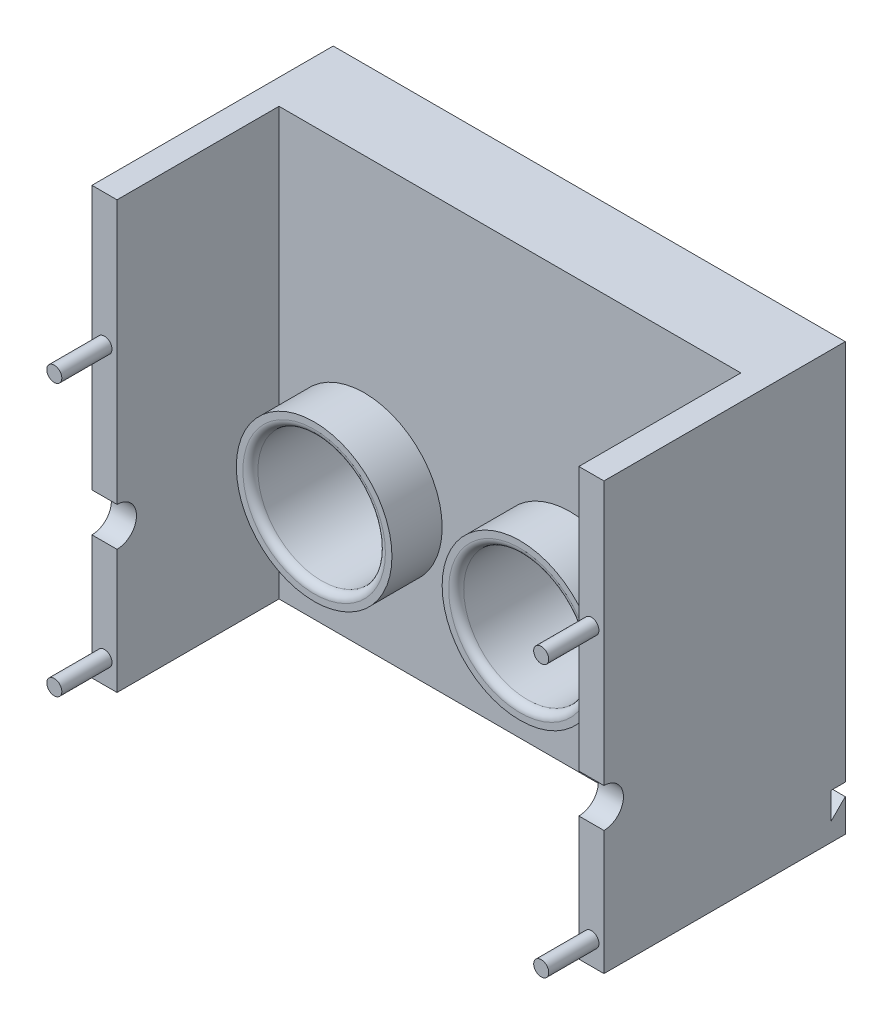
ISO-10303-21;
HEADER;
FILE_DESCRIPTION(('STEP AP214'),'2;1');
FILE_NAME('part.step','',(''),(''),'','','');
FILE_SCHEMA(('AUTOMOTIVE_DESIGN { 1 0 10303 214 1 1 1 1 }'));
ENDSEC;
DATA;
#1=APPLICATION_CONTEXT('core data for automotive mechanical design processes');
#2=APPLICATION_PROTOCOL_DEFINITION('international standard','automotive_design',2000,#1);
#3=PRODUCT_CONTEXT('',#1,'mechanical');
#4=PRODUCT('Part','Part','',(#3));
#5=PRODUCT_RELATED_PRODUCT_CATEGORY('part','',(#4));
#6=PRODUCT_DEFINITION_FORMATION('','',#4);
#7=PRODUCT_DEFINITION_CONTEXT('part definition',#1,'design');
#8=PRODUCT_DEFINITION('design','',#6,#7);
#9=PRODUCT_DEFINITION_SHAPE('','',#8);
#10=(LENGTH_UNIT() NAMED_UNIT(*) SI_UNIT(.MILLI.,.METRE.));
#11=(NAMED_UNIT(*) PLANE_ANGLE_UNIT() SI_UNIT($,.RADIAN.));
#12=(NAMED_UNIT(*) SI_UNIT($,.STERADIAN.) SOLID_ANGLE_UNIT());
#13=UNCERTAINTY_MEASURE_WITH_UNIT(LENGTH_MEASURE(1.E-05),#10,'distance_accuracy_value','');
#14=(GEOMETRIC_REPRESENTATION_CONTEXT(3) GLOBAL_UNCERTAINTY_ASSIGNED_CONTEXT((#13)) GLOBAL_UNIT_ASSIGNED_CONTEXT((#10,
#11,#12)) REPRESENTATION_CONTEXT('',''));
#15=CARTESIAN_POINT('',(0.,0.,0.));
#16=DIRECTION('',(0.,0.,1.));
#17=DIRECTION('',(1.,0.,0.));
#18=AXIS2_PLACEMENT_3D('',#15,#16,#17);
#19=CARTESIAN_POINT('',(51.,85.,-48.065));
#20=DIRECTION('',(0.,0.,1.));
#21=DIRECTION('',(1.,0.,0.));
#22=AXIS2_PLACEMENT_3D('',#19,#20,#21);
#23=PLANE('',#22);
#24=CARTESIAN_POINT('',(-29.,28.575,-48.065));
#25=DIRECTION('',(0.,0.,-1.));
#26=DIRECTION('',(-1.,0.,0.));
#27=AXIS2_PLACEMENT_3D('',#24,#25,#26);
#28=CIRCLE('',#27,12.7);
#29=CARTESIAN_POINT('',(-41.7,28.575,-48.065));
#30=VERTEX_POINT('',#29);
#31=EDGE_CURVE('E246',#30,#30,#28,.T.);
#32=ORIENTED_EDGE('',*,*,#31,.F.);
#33=EDGE_LOOP('',(#32));
#34=FACE_BOUND('',#33,.T.);
#35=CARTESIAN_POINT('',(12.,28.575,-48.065));
#36=DIRECTION('',(0.,0.,-1.));
#37=DIRECTION('',(-1.,0.,0.));
#38=AXIS2_PLACEMENT_3D('',#35,#36,#37);
#39=CIRCLE('',#38,12.7);
#40=CARTESIAN_POINT('',(-0.700000000000003,28.575,-48.065));
#41=VERTEX_POINT('',#40);
#42=EDGE_CURVE('E247',#41,#41,#39,.T.);
#43=ORIENTED_EDGE('',*,*,#42,.F.);
#44=EDGE_LOOP('',(#43));
#45=FACE_BOUND('',#44,.T.);
#46=DIRECTION('',(0.,-1.,0.));
#47=VECTOR('',#46,1.);
#48=CARTESIAN_POINT('',(51.,85.,-48.065));
#49=LINE('',#48,#47);
#50=CARTESIAN_POINT('',(51.,85.,-48.065));
#51=VERTEX_POINT('',#50);
#52=CARTESIAN_POINT('',(51.,9.,-48.065));
#53=VERTEX_POINT('',#52);
#54=EDGE_CURVE('E291',#51,#53,#49,.T.);
#55=ORIENTED_EDGE('',*,*,#54,.T.);
#56=DIRECTION('',(-1.,0.,0.));
#57=VECTOR('',#56,1.);
#58=CARTESIAN_POINT('',(51.,9.,-48.065));
#59=LINE('',#58,#57);
#60=CARTESIAN_POINT('',(-51.,9.,-48.065));
#61=VERTEX_POINT('',#60);
#62=EDGE_CURVE('E183',#53,#61,#59,.T.);
#63=ORIENTED_EDGE('',*,*,#62,.T.);
#64=DIRECTION('',(0.,-1.,0.));
#65=VECTOR('',#64,1.);
#66=CARTESIAN_POINT('',(-51.,85.,-48.065));
#67=LINE('',#66,#65);
#68=CARTESIAN_POINT('',(-51.,85.,-48.065));
#69=VERTEX_POINT('',#68);
#70=EDGE_CURVE('E288',#69,#61,#67,.T.);
#71=ORIENTED_EDGE('',*,*,#70,.F.);
#72=DIRECTION('',(-1.,0.,0.));
#73=VECTOR('',#72,1.);
#74=CARTESIAN_POINT('',(51.,85.,-48.065));
#75=LINE('',#74,#73);
#76=EDGE_CURVE('E279',#51,#69,#75,.T.);
#77=ORIENTED_EDGE('',*,*,#76,.F.);
#78=EDGE_LOOP('',(#55,#63,#71,#77));
#79=FACE_BOUND('',#78,.T.);
#80=ADVANCED_FACE('F41',(#34,#45,#79),#23,.F.);
#81=CARTESIAN_POINT('',(-46.,85.,-32.265));
#82=DIRECTION('',(0.,0.,1.));
#83=DIRECTION('',(1.,0.,0.));
#84=AXIS2_PLACEMENT_3D('',#81,#82,#83);
#85=PLANE('',#84);
#86=CARTESIAN_POINT('',(12.,28.575,-32.265));
#87=DIRECTION('',(0.,0.,1.));
#88=DIRECTION('',(1.,0.,0.));
#89=AXIS2_PLACEMENT_3D('',#86,#87,#88);
#90=CIRCLE('',#89,15.5);
#91=CARTESIAN_POINT('',(27.5,28.575,-32.265));
#92=VERTEX_POINT('',#91);
#93=EDGE_CURVE('E192',#92,#92,#90,.T.);
#94=ORIENTED_EDGE('',*,*,#93,.F.);
#95=EDGE_LOOP('',(#94));
#96=FACE_BOUND('',#95,.T.);
#97=DIRECTION('',(-1.,0.,0.));
#98=VECTOR('',#97,1.);
#99=CARTESIAN_POINT('',(-46.,0.,-32.265));
#100=LINE('',#99,#98);
#101=CARTESIAN_POINT('',(46.,0.,-32.265));
#102=VERTEX_POINT('',#101);
#103=CARTESIAN_POINT('',(-46.,0.,-32.265));
#104=VERTEX_POINT('',#103);
#105=EDGE_CURVE('E263',#102,#104,#100,.T.);
#106=ORIENTED_EDGE('',*,*,#105,.F.);
#107=DIRECTION('',(0.,-1.,0.));
#108=VECTOR('',#107,1.);
#109=CARTESIAN_POINT('',(46.,85.,-32.265));
#110=LINE('',#109,#108);
#111=CARTESIAN_POINT('',(46.,85.,-32.265));
#112=VERTEX_POINT('',#111);
#113=EDGE_CURVE('E269',#112,#102,#110,.T.);
#114=ORIENTED_EDGE('',*,*,#113,.F.);
#115=DIRECTION('',(-1.,0.,0.));
#116=VECTOR('',#115,1.);
#117=CARTESIAN_POINT('',(-46.,85.,-32.265));
#118=LINE('',#117,#116);
#119=CARTESIAN_POINT('',(-46.,85.,-32.265));
#120=VERTEX_POINT('',#119);
#121=EDGE_CURVE('E255',#112,#120,#118,.T.);
#122=ORIENTED_EDGE('',*,*,#121,.T.);
#123=DIRECTION('',(0.,-1.,0.));
#124=VECTOR('',#123,1.);
#125=CARTESIAN_POINT('',(-46.,85.,-32.265));
#126=LINE('',#125,#124);
#127=EDGE_CURVE('E261',#120,#104,#126,.T.);
#128=ORIENTED_EDGE('',*,*,#127,.T.);
#129=EDGE_LOOP('',(#106,#114,#122,#128));
#130=FACE_BOUND('',#129,.T.);
#131=CARTESIAN_POINT('',(-29.,28.575,-32.265));
#132=DIRECTION('',(0.,0.,1.));
#133=DIRECTION('',(1.,0.,0.));
#134=AXIS2_PLACEMENT_3D('',#131,#132,#133);
#135=CIRCLE('',#134,15.5);
#136=CARTESIAN_POINT('',(-13.5,28.575,-32.265));
#137=VERTEX_POINT('',#136);
#138=EDGE_CURVE('E189',#137,#137,#135,.T.);
#139=ORIENTED_EDGE('',*,*,#138,.F.);
#140=EDGE_LOOP('',(#139));
#141=FACE_BOUND('',#140,.T.);
#142=ADVANCED_FACE('F339',(#96,#130,#141),#85,.T.);
#143=CARTESIAN_POINT('',(0.,85.,0.));
#144=DIRECTION('',(0.,1.,0.));
#145=DIRECTION('',(0.,0.,1.));
#146=AXIS2_PLACEMENT_3D('',#143,#144,#145);
#147=PLANE('',#146);
#148=DIRECTION('',(-1.,0.,0.));
#149=VECTOR('',#148,1.);
#150=CARTESIAN_POINT('',(51.,85.,0.));
#151=LINE('',#150,#149);
#152=CARTESIAN_POINT('',(51.,85.,0.));
#153=VERTEX_POINT('',#152);
#154=CARTESIAN_POINT('',(46.,85.,0.));
#155=VERTEX_POINT('',#154);
#156=EDGE_CURVE('E224',#153,#155,#151,.T.);
#157=ORIENTED_EDGE('',*,*,#156,.F.);
#158=DIRECTION('',(0.,0.,-1.));
#159=VECTOR('',#158,1.);
#160=CARTESIAN_POINT('',(51.,85.,48.065));
#161=LINE('',#160,#159);
#162=EDGE_CURVE('E276',#153,#51,#161,.T.);
#163=ORIENTED_EDGE('',*,*,#162,.T.);
#164=ORIENTED_EDGE('',*,*,#76,.T.);
#165=DIRECTION('',(0.,0.,1.));
#166=VECTOR('',#165,1.);
#167=CARTESIAN_POINT('',(-51.,85.,48.065));
#168=LINE('',#167,#166);
#169=CARTESIAN_POINT('',(-51.,85.,0.));
#170=VERTEX_POINT('',#169);
#171=EDGE_CURVE('E273',#69,#170,#168,.T.);
#172=ORIENTED_EDGE('',*,*,#171,.T.);
#173=CARTESIAN_POINT('',(-46.,85.,0.));
#174=VERTEX_POINT('',#173);
#175=EDGE_CURVE('E216',#174,#170,#151,.T.);
#176=ORIENTED_EDGE('',*,*,#175,.F.);
#177=DIRECTION('',(0.,0.,1.));
#178=VECTOR('',#177,1.);
#179=CARTESIAN_POINT('',(-46.,85.,32.265));
#180=LINE('',#179,#178);
#181=EDGE_CURVE('E258',#120,#174,#180,.T.);
#182=ORIENTED_EDGE('',*,*,#181,.F.);
#183=ORIENTED_EDGE('',*,*,#121,.F.);
#184=DIRECTION('',(0.,0.,-1.));
#185=VECTOR('',#184,1.);
#186=CARTESIAN_POINT('',(46.,85.,32.265));
#187=LINE('',#186,#185);
#188=EDGE_CURVE('E253',#155,#112,#187,.T.);
#189=ORIENTED_EDGE('',*,*,#188,.F.);
#190=EDGE_LOOP('',(#157,#163,#164,#172,#176,#182,#183,#189));
#191=FACE_BOUND('',#190,.T.);
#192=ADVANCED_FACE('F347',(#191),#147,.T.);
#193=CARTESIAN_POINT('',(0.,0.,0.));
#194=DIRECTION('',(0.,1.,0.));
#195=DIRECTION('',(0.,0.,1.));
#196=AXIS2_PLACEMENT_3D('',#193,#194,#195);
#197=PLANE('',#196);
#198=DIRECTION('',(0.,0.,-1.));
#199=VECTOR('',#198,1.);
#200=CARTESIAN_POINT('',(51.,0.,48.065));
#201=LINE('',#200,#199);
#202=CARTESIAN_POINT('',(51.,0.,0.));
#203=VERTEX_POINT('',#202);
#204=CARTESIAN_POINT('',(51.,0.,-48.065));
#205=VERTEX_POINT('',#204);
#206=EDGE_CURVE('E284',#203,#205,#201,.T.);
#207=ORIENTED_EDGE('',*,*,#206,.F.);
#208=DIRECTION('',(-1.,0.,0.));
#209=VECTOR('',#208,1.);
#210=CARTESIAN_POINT('',(51.,0.,0.));
#211=LINE('',#210,#209);
#212=CARTESIAN_POINT('',(46.,0.,0.));
#213=VERTEX_POINT('',#212);
#214=EDGE_CURVE('E219',#203,#213,#211,.T.);
#215=ORIENTED_EDGE('',*,*,#214,.T.);
#216=DIRECTION('',(0.,0.,-1.));
#217=VECTOR('',#216,1.);
#218=CARTESIAN_POINT('',(46.,0.,32.265));
#219=LINE('',#218,#217);
#220=EDGE_CURVE('E250',#213,#102,#219,.T.);
#221=ORIENTED_EDGE('',*,*,#220,.T.);
#222=ORIENTED_EDGE('',*,*,#105,.T.);
#223=DIRECTION('',(0.,0.,1.));
#224=VECTOR('',#223,1.);
#225=CARTESIAN_POINT('',(-46.,0.,32.265));
#226=LINE('',#225,#224);
#227=CARTESIAN_POINT('',(-46.,0.,0.));
#228=VERTEX_POINT('',#227);
#229=EDGE_CURVE('E256',#104,#228,#226,.T.);
#230=ORIENTED_EDGE('',*,*,#229,.T.);
#231=CARTESIAN_POINT('',(-51.,0.,0.));
#232=VERTEX_POINT('',#231);
#233=EDGE_CURVE('E223',#228,#232,#211,.T.);
#234=ORIENTED_EDGE('',*,*,#233,.T.);
#235=DIRECTION('',(0.,0.,1.));
#236=VECTOR('',#235,1.);
#237=CARTESIAN_POINT('',(-51.,0.,48.065));
#238=LINE('',#237,#236);
#239=CARTESIAN_POINT('',(-51.,0.,-48.065));
#240=VERTEX_POINT('',#239);
#241=EDGE_CURVE('E272',#240,#232,#238,.T.);
#242=ORIENTED_EDGE('',*,*,#241,.F.);
#243=DIRECTION('',(-1.,0.,0.));
#244=VECTOR('',#243,1.);
#245=CARTESIAN_POINT('',(51.,0.,-48.065));
#246=LINE('',#245,#244);
#247=EDGE_CURVE('E277',#205,#240,#246,.T.);
#248=ORIENTED_EDGE('',*,*,#247,.F.);
#249=EDGE_LOOP('',(#207,#215,#221,#222,#230,#234,#242,#248));
#250=FACE_BOUND('',#249,.T.);
#251=ADVANCED_FACE('F395',(#250),#197,.F.);
#252=CARTESIAN_POINT('',(-51.,85.,48.065));
#253=DIRECTION('',(1.,0.,0.));
#254=DIRECTION('',(0.,0.,-1.));
#255=AXIS2_PLACEMENT_3D('',#252,#253,#254);
#256=PLANE('',#255);
#257=ORIENTED_EDGE('',*,*,#70,.T.);
#258=DIRECTION('',(0.,0.,-1.));
#259=VECTOR('',#258,1.);
#260=CARTESIAN_POINT('',(-51.,9.,-45.2365728752538));
#261=LINE('',#260,#259);
#262=CARTESIAN_POINT('',(-51.,9.,-45.2365728752538));
#263=VERTEX_POINT('',#262);
#264=EDGE_CURVE('E175',#263,#61,#261,.T.);
#265=ORIENTED_EDGE('',*,*,#264,.F.);
#266=DIRECTION('',(0.,1.,0.));
#267=VECTOR('',#266,1.);
#268=CARTESIAN_POINT('',(-51.,3.67157287525381,-45.2365728752538));
#269=LINE('',#268,#267);
#270=CARTESIAN_POINT('',(-51.,3.67157287525381,-45.2365728752538));
#271=VERTEX_POINT('',#270);
#272=EDGE_CURVE('E177',#271,#263,#269,.T.);
#273=ORIENTED_EDGE('',*,*,#272,.F.);
#274=DIRECTION('',(0.,-0.707106781186547,0.707106781186548));
#275=VECTOR('',#274,1.);
#276=CARTESIAN_POINT('',(-51.,6.5,-48.065));
#277=LINE('',#276,#275);
#278=CARTESIAN_POINT('',(-51.,6.5,-48.065));
#279=VERTEX_POINT('',#278);
#280=EDGE_CURVE('E156',#279,#271,#277,.T.);
#281=ORIENTED_EDGE('',*,*,#280,.F.);
#282=EDGE_CURVE('E281',#279,#240,#67,.T.);
#283=ORIENTED_EDGE('',*,*,#282,.T.);
#284=ORIENTED_EDGE('',*,*,#241,.T.);
#285=DIRECTION('',(0.,-1.,0.));
#286=VECTOR('',#285,1.);
#287=CARTESIAN_POINT('',(-51.,85.,0.));
#288=LINE('',#287,#286);
#289=CARTESIAN_POINT('',(-51.,24.7,0.));
#290=VERTEX_POINT('',#289);
#291=EDGE_CURVE('E212',#290,#232,#288,.T.);
#292=ORIENTED_EDGE('',*,*,#291,.F.);
#293=CARTESIAN_POINT('',(-51.,28.575,0.));
#294=DIRECTION('',(-1.,0.,0.));
#295=DIRECTION('',(0.,0.,1.));
#296=AXIS2_PLACEMENT_3D('',#293,#294,#295);
#297=CIRCLE('',#296,3.875);
#298=CARTESIAN_POINT('',(-51.,32.45,0.));
#299=VERTEX_POINT('',#298);
#300=EDGE_CURVE('E240',#299,#290,#297,.T.);
#301=ORIENTED_EDGE('',*,*,#300,.F.);
#302=EDGE_CURVE('E64',#170,#299,#288,.T.);
#303=ORIENTED_EDGE('',*,*,#302,.F.);
#304=ORIENTED_EDGE('',*,*,#171,.F.);
#305=EDGE_LOOP('',(#257,#265,#273,#281,#283,#284,#292,#301,#303,#304));
#306=FACE_BOUND('',#305,.T.);
#307=ADVANCED_FACE('F364',(#306),#256,.F.);
#308=CARTESIAN_POINT('',(51.,85.,48.065));
#309=DIRECTION('',(-1.,0.,0.));
#310=DIRECTION('',(0.,0.,1.));
#311=AXIS2_PLACEMENT_3D('',#308,#309,#310);
#312=PLANE('',#311);
#313=DIRECTION('',(0.,1.,0.));
#314=VECTOR('',#313,1.);
#315=CARTESIAN_POINT('',(51.,3.67157287525381,-45.2365728752538));
#316=LINE('',#315,#314);
#317=CARTESIAN_POINT('',(51.,3.67157287525381,-45.2365728752538));
#318=VERTEX_POINT('',#317);
#319=CARTESIAN_POINT('',(51.,9.,-45.2365728752538));
#320=VERTEX_POINT('',#319);
#321=EDGE_CURVE('E164',#318,#320,#316,.T.);
#322=ORIENTED_EDGE('',*,*,#321,.T.);
#323=DIRECTION('',(0.,0.,-1.));
#324=VECTOR('',#323,1.);
#325=CARTESIAN_POINT('',(51.,9.,-45.2365728752538));
#326=LINE('',#325,#324);
#327=EDGE_CURVE('E169',#320,#53,#326,.T.);
#328=ORIENTED_EDGE('',*,*,#327,.T.);
#329=ORIENTED_EDGE('',*,*,#54,.F.);
#330=ORIENTED_EDGE('',*,*,#162,.F.);
#331=DIRECTION('',(0.,-1.,0.));
#332=VECTOR('',#331,1.);
#333=CARTESIAN_POINT('',(51.,85.,0.));
#334=LINE('',#333,#332);
#335=CARTESIAN_POINT('',(51.,32.45,0.));
#336=VERTEX_POINT('',#335);
#337=EDGE_CURVE('E213',#153,#336,#334,.T.);
#338=ORIENTED_EDGE('',*,*,#337,.T.);
#339=CARTESIAN_POINT('',(51.,28.575,0.));
#340=DIRECTION('',(-1.,0.,0.));
#341=DIRECTION('',(0.,0.,1.));
#342=AXIS2_PLACEMENT_3D('',#339,#340,#341);
#343=CIRCLE('',#342,3.875);
#344=CARTESIAN_POINT('',(51.,24.7,0.));
#345=VERTEX_POINT('',#344);
#346=EDGE_CURVE('E236',#336,#345,#343,.T.);
#347=ORIENTED_EDGE('',*,*,#346,.T.);
#348=EDGE_CURVE('E217',#345,#203,#334,.T.);
#349=ORIENTED_EDGE('',*,*,#348,.T.);
#350=ORIENTED_EDGE('',*,*,#206,.T.);
#351=CARTESIAN_POINT('',(51.,6.50000000000001,-48.065));
#352=VERTEX_POINT('',#351);
#353=EDGE_CURVE('E174',#352,#205,#49,.T.);
#354=ORIENTED_EDGE('',*,*,#353,.F.);
#355=DIRECTION('',(0.,-0.707106781186547,0.707106781186548));
#356=VECTOR('',#355,1.);
#357=CARTESIAN_POINT('',(51.,6.5,-48.065));
#358=LINE('',#357,#356);
#359=EDGE_CURVE('E56',#352,#318,#358,.T.);
#360=ORIENTED_EDGE('',*,*,#359,.T.);
#361=EDGE_LOOP('',(#322,#328,#329,#330,#338,#347,#349,#350,#354,#360));
#362=FACE_BOUND('',#361,.T.);
#363=ADVANCED_FACE('F172',(#362),#312,.F.);
#364=ORIENTED_EDGE('',*,*,#282,.F.);
#365=DIRECTION('',(-1.,0.,0.));
#366=VECTOR('',#365,1.);
#367=CARTESIAN_POINT('',(51.,6.5,-48.065));
#368=LINE('',#367,#366);
#369=EDGE_CURVE('E161',#352,#279,#368,.T.);
#370=ORIENTED_EDGE('',*,*,#369,.F.);
#371=ORIENTED_EDGE('',*,*,#353,.T.);
#372=ORIENTED_EDGE('',*,*,#247,.T.);
#373=EDGE_LOOP('',(#364,#370,#371,#372));
#374=FACE_BOUND('',#373,.T.);
#375=ADVANCED_FACE('F342',(#374),#23,.F.);
#376=CARTESIAN_POINT('',(46.,85.,32.265));
#377=DIRECTION('',(-1.,0.,0.));
#378=DIRECTION('',(0.,0.,1.));
#379=AXIS2_PLACEMENT_3D('',#376,#377,#378);
#380=PLANE('',#379);
#381=DIRECTION('',(0.,-1.,0.));
#382=VECTOR('',#381,1.);
#383=CARTESIAN_POINT('',(46.,85.,0.));
#384=LINE('',#383,#382);
#385=CARTESIAN_POINT('',(46.,32.45,0.));
#386=VERTEX_POINT('',#385);
#387=EDGE_CURVE('E222',#155,#386,#384,.T.);
#388=ORIENTED_EDGE('',*,*,#387,.F.);
#389=ORIENTED_EDGE('',*,*,#188,.T.);
#390=ORIENTED_EDGE('',*,*,#113,.T.);
#391=ORIENTED_EDGE('',*,*,#220,.F.);
#392=CARTESIAN_POINT('',(46.,24.7,0.));
#393=VERTEX_POINT('',#392);
#394=EDGE_CURVE('E227',#393,#213,#384,.T.);
#395=ORIENTED_EDGE('',*,*,#394,.F.);
#396=CARTESIAN_POINT('',(46.,28.575,0.));
#397=DIRECTION('',(-1.,0.,0.));
#398=DIRECTION('',(0.,0.,1.));
#399=AXIS2_PLACEMENT_3D('',#396,#397,#398);
#400=CIRCLE('',#399,3.875);
#401=EDGE_CURVE('E243',#386,#393,#400,.T.);
#402=ORIENTED_EDGE('',*,*,#401,.F.);
#403=EDGE_LOOP('',(#388,#389,#390,#391,#395,#402));
#404=FACE_BOUND('',#403,.T.);
#405=ADVANCED_FACE('F355',(#404),#380,.T.);
#406=CARTESIAN_POINT('',(-46.,85.,32.265));
#407=DIRECTION('',(1.,0.,0.));
#408=DIRECTION('',(0.,0.,-1.));
#409=AXIS2_PLACEMENT_3D('',#406,#407,#408);
#410=PLANE('',#409);
#411=DIRECTION('',(0.,1.,0.));
#412=VECTOR('',#411,1.);
#413=CARTESIAN_POINT('',(-46.,85.,0.));
#414=LINE('',#413,#412);
#415=CARTESIAN_POINT('',(-46.,24.7,0.));
#416=VERTEX_POINT('',#415);
#417=EDGE_CURVE('E233',#228,#416,#414,.T.);
#418=ORIENTED_EDGE('',*,*,#417,.F.);
#419=ORIENTED_EDGE('',*,*,#229,.F.);
#420=ORIENTED_EDGE('',*,*,#127,.F.);
#421=ORIENTED_EDGE('',*,*,#181,.T.);
#422=CARTESIAN_POINT('',(-46.,32.45,0.));
#423=VERTEX_POINT('',#422);
#424=EDGE_CURVE('E230',#423,#174,#414,.T.);
#425=ORIENTED_EDGE('',*,*,#424,.F.);
#426=CARTESIAN_POINT('',(-46.,28.575,0.));
#427=DIRECTION('',(1.,0.,0.));
#428=DIRECTION('',(0.,0.,-1.));
#429=AXIS2_PLACEMENT_3D('',#426,#427,#428);
#430=CIRCLE('',#429,3.875);
#431=EDGE_CURVE('E239',#416,#423,#430,.T.);
#432=ORIENTED_EDGE('',*,*,#431,.F.);
#433=EDGE_LOOP('',(#418,#419,#420,#421,#425,#432));
#434=FACE_BOUND('',#433,.T.);
#435=ADVANCED_FACE('F361',(#434),#410,.T.);
#436=CARTESIAN_POINT('',(-29.,28.575,-28.065));
#437=DIRECTION('',(0.,0.,-1.));
#438=DIRECTION('',(-1.,0.,0.));
#439=AXIS2_PLACEMENT_3D('',#436,#437,#438);
#440=CYLINDRICAL_SURFACE('',#439,12.7);
#441=CARTESIAN_POINT('',(-29.,28.575,-23.765));
#442=DIRECTION('',(0.,0.,1.));
#443=DIRECTION('',(1.,0.,0.));
#444=AXIS2_PLACEMENT_3D('',#441,#442,#443);
#445=CIRCLE('',#444,12.7);
#446=CARTESIAN_POINT('',(-16.3,28.575,-23.765));
#447=VERTEX_POINT('',#446);
#448=EDGE_CURVE('E49',#447,#447,#445,.T.);
#449=ORIENTED_EDGE('',*,*,#448,.T.);
#450=EDGE_LOOP('',(#449));
#451=FACE_BOUND('',#450,.T.);
#452=ORIENTED_EDGE('',*,*,#31,.T.);
#453=EDGE_LOOP('',(#452));
#454=FACE_BOUND('',#453,.T.);
#455=ADVANCED_FACE('F322',(#451,#454),#440,.F.);
#456=CARTESIAN_POINT('',(12.,28.575,-28.065));
#457=DIRECTION('',(0.,0.,-1.));
#458=DIRECTION('',(-1.,0.,0.));
#459=AXIS2_PLACEMENT_3D('',#456,#457,#458);
#460=CYLINDRICAL_SURFACE('',#459,12.7);
#461=CARTESIAN_POINT('',(12.,28.575,-23.765));
#462=DIRECTION('',(0.,0.,1.));
#463=DIRECTION('',(1.,0.,0.));
#464=AXIS2_PLACEMENT_3D('',#461,#462,#463);
#465=CIRCLE('',#464,12.7);
#466=CARTESIAN_POINT('',(24.7,28.575,-23.765));
#467=VERTEX_POINT('',#466);
#468=EDGE_CURVE('E314',#467,#467,#465,.T.);
#469=ORIENTED_EDGE('',*,*,#468,.T.);
#470=EDGE_LOOP('',(#469));
#471=FACE_BOUND('',#470,.T.);
#472=ORIENTED_EDGE('',*,*,#42,.T.);
#473=EDGE_LOOP('',(#472));
#474=FACE_BOUND('',#473,.T.);
#475=ADVANCED_FACE('F475',(#471,#474),#460,.F.);
#476=CARTESIAN_POINT('',(51.,28.575,0.));
#477=DIRECTION('',(-1.,0.,0.));
#478=DIRECTION('',(0.,0.,1.));
#479=AXIS2_PLACEMENT_3D('',#476,#477,#478);
#480=CYLINDRICAL_SURFACE('',#479,3.875);
#481=ORIENTED_EDGE('',*,*,#300,.T.);
#482=DIRECTION('',(-1.,0.,0.));
#483=VECTOR('',#482,1.);
#484=CARTESIAN_POINT('',(51.,24.7,0.));
#485=LINE('',#484,#483);
#486=EDGE_CURVE('E232',#290,#416,#485,.F.);
#487=ORIENTED_EDGE('',*,*,#486,.T.);
#488=ORIENTED_EDGE('',*,*,#431,.T.);
#489=DIRECTION('',(-1.,0.,0.));
#490=VECTOR('',#489,1.);
#491=CARTESIAN_POINT('',(51.,32.45,0.));
#492=LINE('',#491,#490);
#493=EDGE_CURVE('E228',#423,#299,#492,.T.);
#494=ORIENTED_EDGE('',*,*,#493,.T.);
#495=EDGE_LOOP('',(#481,#487,#488,#494));
#496=FACE_BOUND('',#495,.T.);
#497=ADVANCED_FACE('F406',(#496),#480,.F.);
#498=ORIENTED_EDGE('',*,*,#401,.T.);
#499=DIRECTION('',(-1.,0.,0.));
#500=VECTOR('',#499,1.);
#501=CARTESIAN_POINT('',(51.,24.7,0.));
#502=LINE('',#501,#500);
#503=EDGE_CURVE('E299',#393,#345,#502,.F.);
#504=ORIENTED_EDGE('',*,*,#503,.T.);
#505=ORIENTED_EDGE('',*,*,#346,.F.);
#506=DIRECTION('',(-1.,0.,0.));
#507=VECTOR('',#506,1.);
#508=CARTESIAN_POINT('',(51.,32.45,0.));
#509=LINE('',#508,#507);
#510=EDGE_CURVE('E294',#336,#386,#509,.T.);
#511=ORIENTED_EDGE('',*,*,#510,.T.);
#512=EDGE_LOOP('',(#498,#504,#505,#511));
#513=FACE_BOUND('',#512,.T.);
#514=ADVANCED_FACE('F390',(#513),#480,.F.);
#515=CARTESIAN_POINT('',(51.,85.,0.));
#516=DIRECTION('',(0.,0.,-1.));
#517=DIRECTION('',(-1.,0.,0.));
#518=AXIS2_PLACEMENT_3D('',#515,#516,#517);
#519=PLANE('',#518);
#520=CARTESIAN_POINT('',(48.5,58.725,0.));
#521=DIRECTION('',(0.,0.,-1.));
#522=DIRECTION('',(-1.,0.,0.));
#523=AXIS2_PLACEMENT_3D('',#520,#521,#522);
#524=CIRCLE('',#523,1.5);
#525=CARTESIAN_POINT('',(47.,58.725,0.));
#526=VERTEX_POINT('',#525);
#527=EDGE_CURVE('E311',#526,#526,#524,.F.);
#528=ORIENTED_EDGE('',*,*,#527,.F.);
#529=EDGE_LOOP('',(#528));
#530=FACE_BOUND('',#529,.T.);
#531=ORIENTED_EDGE('',*,*,#387,.T.);
#532=ORIENTED_EDGE('',*,*,#510,.F.);
#533=ORIENTED_EDGE('',*,*,#337,.F.);
#534=ORIENTED_EDGE('',*,*,#156,.T.);
#535=EDGE_LOOP('',(#531,#532,#533,#534));
#536=FACE_BOUND('',#535,.T.);
#537=ADVANCED_FACE('F384',(#530,#536),#519,.F.);
#538=CARTESIAN_POINT('',(48.5,4.675,0.));
#539=DIRECTION('',(0.,0.,-1.));
#540=DIRECTION('',(-1.,0.,0.));
#541=AXIS2_PLACEMENT_3D('',#538,#539,#540);
#542=CIRCLE('',#541,1.5);
#543=CARTESIAN_POINT('',(47.,4.675,0.));
#544=VERTEX_POINT('',#543);
#545=EDGE_CURVE('E308',#544,#544,#542,.F.);
#546=ORIENTED_EDGE('',*,*,#545,.F.);
#547=EDGE_LOOP('',(#546));
#548=FACE_BOUND('',#547,.T.);
#549=ORIENTED_EDGE('',*,*,#394,.T.);
#550=ORIENTED_EDGE('',*,*,#214,.F.);
#551=ORIENTED_EDGE('',*,*,#348,.F.);
#552=ORIENTED_EDGE('',*,*,#503,.F.);
#553=EDGE_LOOP('',(#549,#550,#551,#552));
#554=FACE_BOUND('',#553,.T.);
#555=ADVANCED_FACE('F471',(#548,#554),#519,.F.);
#556=CARTESIAN_POINT('',(-48.5,58.725,0.));
#557=DIRECTION('',(0.,0.,-1.));
#558=DIRECTION('',(-1.,0.,0.));
#559=AXIS2_PLACEMENT_3D('',#556,#557,#558);
#560=CIRCLE('',#559,1.5);
#561=CARTESIAN_POINT('',(-50.,58.725,0.));
#562=VERTEX_POINT('',#561);
#563=EDGE_CURVE('E302',#562,#562,#560,.F.);
#564=ORIENTED_EDGE('',*,*,#563,.F.);
#565=EDGE_LOOP('',(#564));
#566=FACE_BOUND('',#565,.T.);
#567=ORIENTED_EDGE('',*,*,#424,.T.);
#568=ORIENTED_EDGE('',*,*,#175,.T.);
#569=ORIENTED_EDGE('',*,*,#302,.T.);
#570=ORIENTED_EDGE('',*,*,#493,.F.);
#571=EDGE_LOOP('',(#567,#568,#569,#570));
#572=FACE_BOUND('',#571,.T.);
#573=ADVANCED_FACE('F557',(#566,#572),#519,.F.);
#574=CARTESIAN_POINT('',(-48.5,4.67499999999998,0.));
#575=DIRECTION('',(0.,0.,-1.));
#576=DIRECTION('',(-1.,0.,0.));
#577=AXIS2_PLACEMENT_3D('',#574,#575,#576);
#578=CIRCLE('',#577,1.5);
#579=CARTESIAN_POINT('',(-50.,4.67499999999998,0.));
#580=VERTEX_POINT('',#579);
#581=EDGE_CURVE('E305',#580,#580,#578,.F.);
#582=ORIENTED_EDGE('',*,*,#581,.F.);
#583=EDGE_LOOP('',(#582));
#584=FACE_BOUND('',#583,.T.);
#585=ORIENTED_EDGE('',*,*,#417,.T.);
#586=ORIENTED_EDGE('',*,*,#486,.F.);
#587=ORIENTED_EDGE('',*,*,#291,.T.);
#588=ORIENTED_EDGE('',*,*,#233,.F.);
#589=EDGE_LOOP('',(#585,#586,#587,#588));
#590=FACE_BOUND('',#589,.T.);
#591=ADVANCED_FACE('F400',(#584,#590),#519,.F.);
#592=CARTESIAN_POINT('',(-48.5,58.725,10.));
#593=DIRECTION('',(0.,0.,-1.));
#594=DIRECTION('',(-1.,0.,0.));
#595=AXIS2_PLACEMENT_3D('',#592,#593,#594);
#596=CYLINDRICAL_SURFACE('',#595,1.5);
#597=CARTESIAN_POINT('',(-48.5,58.725,10.));
#598=DIRECTION('',(0.,0.,1.));
#599=DIRECTION('',(1.,0.,0.));
#600=AXIS2_PLACEMENT_3D('',#597,#598,#599);
#601=CIRCLE('',#600,1.5);
#602=CARTESIAN_POINT('',(-47.,58.725,10.));
#603=VERTEX_POINT('',#602);
#604=EDGE_CURVE('E209',#603,#603,#601,.T.);
#605=ORIENTED_EDGE('',*,*,#604,.F.);
#606=EDGE_LOOP('',(#605));
#607=FACE_BOUND('',#606,.T.);
#608=ORIENTED_EDGE('',*,*,#563,.T.);
#609=EDGE_LOOP('',(#608));
#610=FACE_BOUND('',#609,.T.);
#611=ADVANCED_FACE('F464',(#607,#610),#596,.T.);
#612=CARTESIAN_POINT('',(-48.5,58.725,10.));
#613=DIRECTION('',(0.,0.,1.));
#614=DIRECTION('',(1.,0.,0.));
#615=AXIS2_PLACEMENT_3D('',#612,#613,#614);
#616=PLANE('',#615);
#617=ORIENTED_EDGE('',*,*,#604,.T.);
#618=EDGE_LOOP('',(#617));
#619=FACE_BOUND('',#618,.T.);
#620=ADVANCED_FACE('F457',(#619),#616,.T.);
#621=CARTESIAN_POINT('',(-48.5,4.67499999999998,10.));
#622=DIRECTION('',(0.,0.,-1.));
#623=DIRECTION('',(-1.,0.,0.));
#624=AXIS2_PLACEMENT_3D('',#621,#622,#623);
#625=CYLINDRICAL_SURFACE('',#624,1.5);
#626=CARTESIAN_POINT('',(-48.5,4.67499999999998,10.));
#627=DIRECTION('',(0.,0.,1.));
#628=DIRECTION('',(-1.,0.,0.));
#629=AXIS2_PLACEMENT_3D('',#626,#627,#628);
#630=CIRCLE('',#629,1.5);
#631=CARTESIAN_POINT('',(-50.,4.67499999999998,10.));
#632=VERTEX_POINT('',#631);
#633=EDGE_CURVE('E206',#632,#632,#630,.T.);
#634=ORIENTED_EDGE('',*,*,#633,.F.);
#635=EDGE_LOOP('',(#634));
#636=FACE_BOUND('',#635,.T.);
#637=ORIENTED_EDGE('',*,*,#581,.T.);
#638=EDGE_LOOP('',(#637));
#639=FACE_BOUND('',#638,.T.);
#640=ADVANCED_FACE('F454',(#636,#639),#625,.T.);
#641=CARTESIAN_POINT('',(-48.5,4.67499999999998,10.));
#642=DIRECTION('',(0.,0.,-1.));
#643=DIRECTION('',(-1.,0.,0.));
#644=AXIS2_PLACEMENT_3D('',#641,#642,#643);
#645=PLANE('',#644);
#646=ORIENTED_EDGE('',*,*,#633,.T.);
#647=EDGE_LOOP('',(#646));
#648=FACE_BOUND('',#647,.T.);
#649=ADVANCED_FACE('F449',(#648),#645,.F.);
#650=CARTESIAN_POINT('',(48.5,4.675,10.));
#651=DIRECTION('',(0.,0.,-1.));
#652=DIRECTION('',(-1.,0.,0.));
#653=AXIS2_PLACEMENT_3D('',#650,#651,#652);
#654=CYLINDRICAL_SURFACE('',#653,1.5);
#655=CARTESIAN_POINT('',(48.5,4.675,10.));
#656=DIRECTION('',(0.,0.,1.));
#657=DIRECTION('',(1.,0.,0.));
#658=AXIS2_PLACEMENT_3D('',#655,#656,#657);
#659=CIRCLE('',#658,1.5);
#660=CARTESIAN_POINT('',(50.,4.675,10.));
#661=VERTEX_POINT('',#660);
#662=EDGE_CURVE('E203',#661,#661,#659,.T.);
#663=ORIENTED_EDGE('',*,*,#662,.F.);
#664=EDGE_LOOP('',(#663));
#665=FACE_BOUND('',#664,.T.);
#666=ORIENTED_EDGE('',*,*,#545,.T.);
#667=EDGE_LOOP('',(#666));
#668=FACE_BOUND('',#667,.T.);
#669=ADVANCED_FACE('F446',(#665,#668),#654,.T.);
#670=CARTESIAN_POINT('',(48.5,4.675,10.));
#671=DIRECTION('',(0.,0.,1.));
#672=DIRECTION('',(1.,0.,0.));
#673=AXIS2_PLACEMENT_3D('',#670,#671,#672);
#674=PLANE('',#673);
#675=ORIENTED_EDGE('',*,*,#662,.T.);
#676=EDGE_LOOP('',(#675));
#677=FACE_BOUND('',#676,.T.);
#678=ADVANCED_FACE('F441',(#677),#674,.T.);
#679=CARTESIAN_POINT('',(48.5,58.725,10.));
#680=DIRECTION('',(0.,0.,-1.));
#681=DIRECTION('',(-1.,0.,0.));
#682=AXIS2_PLACEMENT_3D('',#679,#680,#681);
#683=CYLINDRICAL_SURFACE('',#682,1.5);
#684=CARTESIAN_POINT('',(48.5,58.725,10.));
#685=DIRECTION('',(0.,0.,1.));
#686=DIRECTION('',(-1.,0.,0.));
#687=AXIS2_PLACEMENT_3D('',#684,#685,#686);
#688=CIRCLE('',#687,1.5);
#689=CARTESIAN_POINT('',(47.,58.725,10.));
#690=VERTEX_POINT('',#689);
#691=EDGE_CURVE('E198',#690,#690,#688,.T.);
#692=ORIENTED_EDGE('',*,*,#691,.F.);
#693=EDGE_LOOP('',(#692));
#694=FACE_BOUND('',#693,.T.);
#695=ORIENTED_EDGE('',*,*,#527,.T.);
#696=EDGE_LOOP('',(#695));
#697=FACE_BOUND('',#696,.T.);
#698=ADVANCED_FACE('F438',(#694,#697),#683,.T.);
#699=CARTESIAN_POINT('',(48.5,58.725,10.));
#700=DIRECTION('',(0.,0.,-1.));
#701=DIRECTION('',(-1.,0.,0.));
#702=AXIS2_PLACEMENT_3D('',#699,#700,#701);
#703=PLANE('',#702);
#704=ORIENTED_EDGE('',*,*,#691,.T.);
#705=EDGE_LOOP('',(#704));
#706=FACE_BOUND('',#705,.T.);
#707=ADVANCED_FACE('F434',(#706),#703,.F.);
#708=CARTESIAN_POINT('',(12.,28.575,-22.265));
#709=DIRECTION('',(0.,0.,1.));
#710=DIRECTION('',(1.,0.,0.));
#711=AXIS2_PLACEMENT_3D('',#708,#709,#710);
#712=PLANE('',#711);
#713=CARTESIAN_POINT('',(12.,28.575,-22.265));
#714=DIRECTION('',(0.,0.,1.));
#715=DIRECTION('',(1.,0.,0.));
#716=AXIS2_PLACEMENT_3D('',#713,#714,#715);
#717=CIRCLE('',#716,14.2);
#718=CARTESIAN_POINT('',(26.2,28.575,-22.265));
#719=VERTEX_POINT('',#718);
#720=EDGE_CURVE('E317',#719,#719,#717,.F.);
#721=ORIENTED_EDGE('',*,*,#720,.T.);
#722=EDGE_LOOP('',(#721));
#723=FACE_BOUND('',#722,.T.);
#724=CARTESIAN_POINT('',(12.,28.575,-22.265));
#725=DIRECTION('',(0.,0.,1.));
#726=DIRECTION('',(1.,0.,0.));
#727=AXIS2_PLACEMENT_3D('',#724,#725,#726);
#728=CIRCLE('',#727,15.5);
#729=CARTESIAN_POINT('',(27.5,28.575,-22.265));
#730=VERTEX_POINT('',#729);
#731=EDGE_CURVE('E195',#730,#730,#728,.T.);
#732=ORIENTED_EDGE('',*,*,#731,.T.);
#733=EDGE_LOOP('',(#732));
#734=FACE_BOUND('',#733,.T.);
#735=ADVANCED_FACE('F431',(#723,#734),#712,.T.);
#736=CARTESIAN_POINT('',(12.,28.575,-22.265));
#737=DIRECTION('',(0.,0.,-1.));
#738=DIRECTION('',(-1.,0.,0.));
#739=AXIS2_PLACEMENT_3D('',#736,#737,#738);
#740=CYLINDRICAL_SURFACE('',#739,15.5);
#741=ORIENTED_EDGE('',*,*,#731,.F.);
#742=EDGE_LOOP('',(#741));
#743=FACE_BOUND('',#742,.T.);
#744=ORIENTED_EDGE('',*,*,#93,.T.);
#745=EDGE_LOOP('',(#744));
#746=FACE_BOUND('',#745,.T.);
#747=ADVANCED_FACE('F424',(#743,#746),#740,.T.);
#748=CARTESIAN_POINT('',(-29.,28.575,-22.265));
#749=DIRECTION('',(0.,0.,1.));
#750=DIRECTION('',(1.,0.,0.));
#751=AXIS2_PLACEMENT_3D('',#748,#749,#750);
#752=PLANE('',#751);
#753=CARTESIAN_POINT('',(-29.,28.575,-22.265));
#754=DIRECTION('',(0.,0.,1.));
#755=DIRECTION('',(1.,0.,0.));
#756=AXIS2_PLACEMENT_3D('',#753,#754,#755);
#757=CIRCLE('',#756,14.2);
#758=CARTESIAN_POINT('',(-14.8,28.575,-22.265));
#759=VERTEX_POINT('',#758);
#760=EDGE_CURVE('E11',#759,#759,#757,.F.);
#761=ORIENTED_EDGE('',*,*,#760,.T.);
#762=EDGE_LOOP('',(#761));
#763=FACE_BOUND('',#762,.T.);
#764=CARTESIAN_POINT('',(-29.,28.575,-22.265));
#765=DIRECTION('',(0.,0.,1.));
#766=DIRECTION('',(1.,0.,0.));
#767=AXIS2_PLACEMENT_3D('',#764,#765,#766);
#768=CIRCLE('',#767,15.5);
#769=CARTESIAN_POINT('',(-13.5,28.575,-22.265));
#770=VERTEX_POINT('',#769);
#771=EDGE_CURVE('E186',#770,#770,#768,.T.);
#772=ORIENTED_EDGE('',*,*,#771,.T.);
#773=EDGE_LOOP('',(#772));
#774=FACE_BOUND('',#773,.T.);
#775=ADVANCED_FACE('F416',(#763,#774),#752,.T.);
#776=CARTESIAN_POINT('',(-29.,28.575,-22.265));
#777=DIRECTION('',(0.,0.,-1.));
#778=DIRECTION('',(-1.,0.,0.));
#779=AXIS2_PLACEMENT_3D('',#776,#777,#778);
#780=CYLINDRICAL_SURFACE('',#779,15.5);
#781=ORIENTED_EDGE('',*,*,#771,.F.);
#782=EDGE_LOOP('',(#781));
#783=FACE_BOUND('',#782,.T.);
#784=ORIENTED_EDGE('',*,*,#138,.T.);
#785=EDGE_LOOP('',(#784));
#786=FACE_BOUND('',#785,.T.);
#787=ADVANCED_FACE('F336',(#783,#786),#780,.T.);
#788=CARTESIAN_POINT('',(12.,28.575,-23.765));
#789=DIRECTION('',(0.,0.,1.));
#790=DIRECTION('',(1.,0.,0.));
#791=AXIS2_PLACEMENT_3D('',#788,#789,#790);
#792=TOROIDAL_SURFACE('',#791,14.2,1.5);
#793=ORIENTED_EDGE('',*,*,#720,.F.);
#794=EDGE_LOOP('',(#793));
#795=FACE_BOUND('',#794,.T.);
#796=ORIENTED_EDGE('',*,*,#468,.F.);
#797=EDGE_LOOP('',(#796));
#798=FACE_BOUND('',#797,.T.);
#799=ADVANCED_FACE('F327',(#795,#798),#792,.T.);
#800=CARTESIAN_POINT('',(-29.,28.575,-23.765));
#801=DIRECTION('',(0.,0.,1.));
#802=DIRECTION('',(1.,0.,0.));
#803=AXIS2_PLACEMENT_3D('',#800,#801,#802);
#804=TOROIDAL_SURFACE('',#803,14.2,1.5);
#805=ORIENTED_EDGE('',*,*,#760,.F.);
#806=EDGE_LOOP('',(#805));
#807=FACE_BOUND('',#806,.T.);
#808=ORIENTED_EDGE('',*,*,#448,.F.);
#809=EDGE_LOOP('',(#808));
#810=FACE_BOUND('',#809,.T.);
#811=ADVANCED_FACE('F43',(#807,#810),#804,.T.);
#812=CARTESIAN_POINT('',(51.,9.,-45.2365728752538));
#813=DIRECTION('',(0.,1.,0.));
#814=DIRECTION('',(0.,0.,1.));
#815=AXIS2_PLACEMENT_3D('',#812,#813,#814);
#816=PLANE('',#815);
#817=ORIENTED_EDGE('',*,*,#264,.T.);
#818=ORIENTED_EDGE('',*,*,#62,.F.);
#819=ORIENTED_EDGE('',*,*,#327,.F.);
#820=DIRECTION('',(-1.,0.,0.));
#821=VECTOR('',#820,1.);
#822=CARTESIAN_POINT('',(51.,9.,-45.2365728752538));
#823=LINE('',#822,#821);
#824=EDGE_CURVE('E160',#320,#263,#823,.T.);
#825=ORIENTED_EDGE('',*,*,#824,.T.);
#826=EDGE_LOOP('',(#817,#818,#819,#825));
#827=FACE_BOUND('',#826,.T.);
#828=ADVANCED_FACE('F326',(#827),#816,.F.);
#829=CARTESIAN_POINT('',(51.,3.67157287525381,-45.2365728752538));
#830=DIRECTION('',(0.,0.,1.));
#831=DIRECTION('',(1.,0.,0.));
#832=AXIS2_PLACEMENT_3D('',#829,#830,#831);
#833=PLANE('',#832);
#834=ORIENTED_EDGE('',*,*,#272,.T.);
#835=ORIENTED_EDGE('',*,*,#824,.F.);
#836=ORIENTED_EDGE('',*,*,#321,.F.);
#837=DIRECTION('',(-1.,0.,0.));
#838=VECTOR('',#837,1.);
#839=CARTESIAN_POINT('',(51.,3.67157287525381,-45.2365728752538));
#840=LINE('',#839,#838);
#841=EDGE_CURVE('E152',#318,#271,#840,.T.);
#842=ORIENTED_EDGE('',*,*,#841,.T.);
#843=EDGE_LOOP('',(#834,#835,#836,#842));
#844=FACE_BOUND('',#843,.T.);
#845=ADVANCED_FACE('F165',(#844),#833,.F.);
#846=CARTESIAN_POINT('',(51.,6.5,-48.065));
#847=DIRECTION('',(0.,-0.707106781186548,-0.707106781186547));
#848=DIRECTION('',(0.,0.707106781186547,-0.707106781186548));
#849=AXIS2_PLACEMENT_3D('',#846,#847,#848);
#850=PLANE('',#849);
#851=ORIENTED_EDGE('',*,*,#280,.T.);
#852=ORIENTED_EDGE('',*,*,#841,.F.);
#853=ORIENTED_EDGE('',*,*,#359,.F.);
#854=ORIENTED_EDGE('',*,*,#369,.T.);
#855=EDGE_LOOP('',(#851,#852,#853,#854));
#856=FACE_BOUND('',#855,.T.);
#857=ADVANCED_FACE('F154',(#856),#850,.F.);
#858=CLOSED_SHELL('',(#80,#142,#192,#251,#307,#363,#375,#405,#435,#455,#475,#497,#514,#537,#555,
#573,#591,#611,#620,#640,#649,#669,#678,#698,#707,#735,#747,#775,#787,#799,#811,#828,#845,#857));
#859=MANIFOLD_SOLID_BREP('B2',#858);
#860=ADVANCED_BREP_SHAPE_REPRESENTATION('',(#18,#859),#14);
#861=SHAPE_DEFINITION_REPRESENTATION(#9,#860);
ENDSEC;
END-ISO-10303-21;
